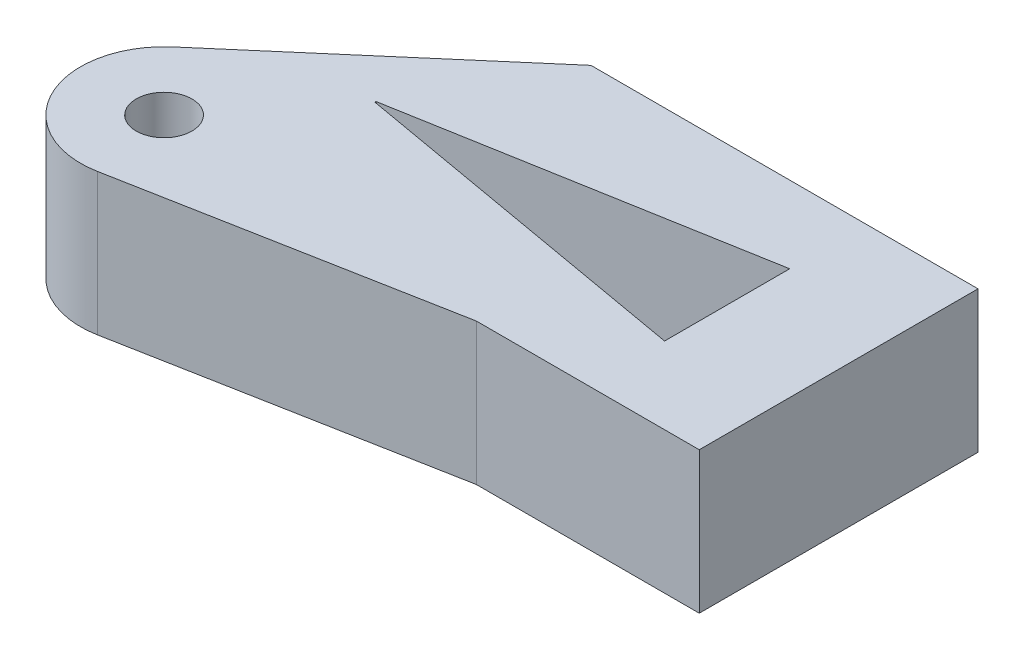
ISO-10303-21;
HEADER;
FILE_DESCRIPTION(('STEP AP214'),'2;1');
FILE_NAME('part.step','',(''),(''),'','','');
FILE_SCHEMA(('AUTOMOTIVE_DESIGN { 1 0 10303 214 1 1 1 1 }'));
ENDSEC;
DATA;
#1=APPLICATION_CONTEXT('core data for automotive mechanical design processes');
#2=APPLICATION_PROTOCOL_DEFINITION('international standard','automotive_design',2000,#1);
#3=PRODUCT_CONTEXT('',#1,'mechanical');
#4=PRODUCT('Part','Part','',(#3));
#5=PRODUCT_RELATED_PRODUCT_CATEGORY('part','',(#4));
#6=PRODUCT_DEFINITION_FORMATION('','',#4);
#7=PRODUCT_DEFINITION_CONTEXT('part definition',#1,'design');
#8=PRODUCT_DEFINITION('design','',#6,#7);
#9=PRODUCT_DEFINITION_SHAPE('','',#8);
#10=(LENGTH_UNIT() NAMED_UNIT(*) SI_UNIT(.MILLI.,.METRE.));
#11=(NAMED_UNIT(*) PLANE_ANGLE_UNIT() SI_UNIT($,.RADIAN.));
#12=(NAMED_UNIT(*) SI_UNIT($,.STERADIAN.) SOLID_ANGLE_UNIT());
#13=UNCERTAINTY_MEASURE_WITH_UNIT(LENGTH_MEASURE(1.E-05),#10,'distance_accuracy_value','');
#14=(GEOMETRIC_REPRESENTATION_CONTEXT(3) GLOBAL_UNCERTAINTY_ASSIGNED_CONTEXT((#13)) GLOBAL_UNIT_ASSIGNED_CONTEXT((#10,
#11,#12)) REPRESENTATION_CONTEXT('',''));
#15=CARTESIAN_POINT('',(0.,0.,0.));
#16=DIRECTION('',(0.,0.,1.));
#17=DIRECTION('',(1.,0.,0.));
#18=AXIS2_PLACEMENT_3D('',#15,#16,#17);
#19=CARTESIAN_POINT('',(-30.,6.35,10.5));
#20=DIRECTION('',(0.,-1.,0.));
#21=DIRECTION('',(0.,0.,-1.));
#22=AXIS2_PLACEMENT_3D('',#19,#20,#21);
#23=PLANE('',#22);
#24=CARTESIAN_POINT('',(-30.,6.35,10.5));
#25=DIRECTION('',(0.,1.,0.));
#26=DIRECTION('',(0.,0.,1.));
#27=AXIS2_PLACEMENT_3D('',#24,#25,#26);
#28=CIRCLE('',#27,2.5);
#29=CARTESIAN_POINT('',(-30.,6.35,13.));
#30=VERTEX_POINT('',#29);
#31=EDGE_CURVE('E146',#30,#30,#28,.T.);
#32=ORIENTED_EDGE('',*,*,#31,.F.);
#33=EDGE_LOOP('',(#32));
#34=FACE_BOUND('',#33,.T.);
#35=DIRECTION('',(-1.,0.,0.));
#36=VECTOR('',#35,1.);
#37=CARTESIAN_POINT('',(-14.7120380952852,6.35,-12.5));
#38=LINE('',#37,#36);
#39=CARTESIAN_POINT('',(20.,6.35,-12.5));
#40=VERTEX_POINT('',#39);
#41=CARTESIAN_POINT('',(-14.7120380952852,6.35,-12.5));
#42=VERTEX_POINT('',#41);
#43=EDGE_CURVE('E152',#40,#42,#38,.T.);
#44=ORIENTED_EDGE('',*,*,#43,.T.);
#45=DIRECTION('',(-0.758922798069636,0.,0.651180609792824));
#46=VECTOR('',#45,1.);
#47=CARTESIAN_POINT('',(-34.8838545734462,6.35,4.80807901447773));
#48=LINE('',#47,#46);
#49=CARTESIAN_POINT('',(-34.8838545734462,6.35,4.80807901447773));
#50=VERTEX_POINT('',#49);
#51=EDGE_CURVE('E155',#42,#50,#48,.T.);
#52=ORIENTED_EDGE('',*,*,#51,.T.);
#53=CARTESIAN_POINT('',(-30.,6.35,10.5));
#54=DIRECTION('',(0.,1.,0.));
#55=DIRECTION('',(0.,0.,-1.));
#56=AXIS2_PLACEMENT_3D('',#53,#54,#55);
#57=CIRCLE('',#56,7.5);
#58=CARTESIAN_POINT('',(-28.6164183637679,6.35,17.8712754565191));
#59=VERTEX_POINT('',#58);
#60=EDGE_CURVE('E158',#50,#59,#57,.T.);
#61=ORIENTED_EDGE('',*,*,#60,.T.);
#62=DIRECTION('',(0.982836727535885,0.,-0.184477551497608));
#63=VECTOR('',#62,1.);
#64=CARTESIAN_POINT('',(-28.6164183637679,6.35,17.8712754565191));
#65=LINE('',#64,#63);
#66=CARTESIAN_POINT('',(0.,6.35,12.5));
#67=VERTEX_POINT('',#66);
#68=EDGE_CURVE('E160',#59,#67,#65,.T.);
#69=ORIENTED_EDGE('',*,*,#68,.T.);
#70=DIRECTION('',(1.,0.,0.));
#71=VECTOR('',#70,1.);
#72=CARTESIAN_POINT('',(0.,6.35,12.5));
#73=LINE('',#72,#71);
#74=CARTESIAN_POINT('',(20.,6.35,12.5));
#75=VERTEX_POINT('',#74);
#76=EDGE_CURVE('E162',#67,#75,#73,.T.);
#77=ORIENTED_EDGE('',*,*,#76,.T.);
#78=DIRECTION('',(0.,0.,-1.));
#79=VECTOR('',#78,1.);
#80=CARTESIAN_POINT('',(20.,6.35,-12.5));
#81=LINE('',#80,#79);
#82=EDGE_CURVE('E164',#75,#40,#81,.T.);
#83=ORIENTED_EDGE('',*,*,#82,.T.);
#84=EDGE_LOOP('',(#44,#52,#61,#69,#77,#83));
#85=FACE_BOUND('',#84,.T.);
#86=DIRECTION('',(-0.984807753012208,0.,0.173648177666931));
#87=VECTOR('',#86,1.);
#88=CARTESIAN_POINT('',(-21.5420432854016,6.35,-0.051346502412947));
#89=LINE('',#88,#87);
#90=CARTESIAN_POINT('',(10.,6.35,-5.61305976030355));
#91=VERTEX_POINT('',#90);
#92=CARTESIAN_POINT('',(-21.5420432854016,6.35,-0.051346502412947));
#93=VERTEX_POINT('',#92);
#94=EDGE_CURVE('E110',#91,#93,#89,.T.);
#95=ORIENTED_EDGE('',*,*,#94,.F.);
#96=DIRECTION('',(0.,0.,-1.));
#97=VECTOR('',#96,1.);
#98=CARTESIAN_POINT('',(10.,6.35,-5.61305976030355));
#99=LINE('',#98,#97);
#100=CARTESIAN_POINT('',(9.99999999999999,6.35,5.61305976030355));
#101=VERTEX_POINT('',#100);
#102=EDGE_CURVE('E132',#101,#91,#99,.T.);
#103=ORIENTED_EDGE('',*,*,#102,.F.);
#104=DIRECTION('',(0.984807753012208,0.,0.173648177666931));
#105=VECTOR('',#104,1.);
#106=CARTESIAN_POINT('',(10.,6.35,5.61305976030355));
#107=LINE('',#106,#105);
#108=CARTESIAN_POINT('',(-21.5420432854016,6.35,0.051346502412947));
#109=VERTEX_POINT('',#108);
#110=EDGE_CURVE('E130',#109,#101,#107,.T.);
#111=ORIENTED_EDGE('',*,*,#110,.F.);
#112=DIRECTION('',(0.,0.,1.));
#113=VECTOR('',#112,1.);
#114=CARTESIAN_POINT('',(-21.5420432854016,6.35,-0.051346502412947));
#115=LINE('',#114,#113);
#116=EDGE_CURVE('E118',#93,#109,#115,.T.);
#117=ORIENTED_EDGE('',*,*,#116,.F.);
#118=EDGE_LOOP('',(#95,#103,#111,#117));
#119=FACE_BOUND('',#118,.T.);
#120=ADVANCED_FACE('F33',(#34,#85,#119),#23,.F.);
#121=CARTESIAN_POINT('',(-30.,-6.35,10.5));
#122=DIRECTION('',(0.,-1.,0.));
#123=DIRECTION('',(0.,0.,-1.));
#124=AXIS2_PLACEMENT_3D('',#121,#122,#123);
#125=PLANE('',#124);
#126=DIRECTION('',(-1.,0.,0.));
#127=VECTOR('',#126,1.);
#128=CARTESIAN_POINT('',(-14.7120380952852,-6.35,-12.5));
#129=LINE('',#128,#127);
#130=CARTESIAN_POINT('',(20.,-6.35,-12.5));
#131=VERTEX_POINT('',#130);
#132=CARTESIAN_POINT('',(-14.7120380952852,-6.35,-12.5));
#133=VERTEX_POINT('',#132);
#134=EDGE_CURVE('E149',#131,#133,#129,.T.);
#135=ORIENTED_EDGE('',*,*,#134,.F.);
#136=DIRECTION('',(0.,0.,-1.));
#137=VECTOR('',#136,1.);
#138=CARTESIAN_POINT('',(20.,-6.35,-12.5));
#139=LINE('',#138,#137);
#140=CARTESIAN_POINT('',(20.,-6.35,12.5));
#141=VERTEX_POINT('',#140);
#142=EDGE_CURVE('E156',#141,#131,#139,.T.);
#143=ORIENTED_EDGE('',*,*,#142,.F.);
#144=DIRECTION('',(1.,0.,0.));
#145=VECTOR('',#144,1.);
#146=CARTESIAN_POINT('',(0.,-6.35,12.5));
#147=LINE('',#146,#145);
#148=CARTESIAN_POINT('',(0.,-6.35,12.5));
#149=VERTEX_POINT('',#148);
#150=EDGE_CURVE('E175',#149,#141,#147,.T.);
#151=ORIENTED_EDGE('',*,*,#150,.F.);
#152=DIRECTION('',(0.982836727535885,0.,-0.184477551497608));
#153=VECTOR('',#152,1.);
#154=CARTESIAN_POINT('',(-28.6164183637679,-6.35,17.8712754565191));
#155=LINE('',#154,#153);
#156=CARTESIAN_POINT('',(-28.6164183637679,-6.35,17.8712754565191));
#157=VERTEX_POINT('',#156);
#158=EDGE_CURVE('E173',#157,#149,#155,.T.);
#159=ORIENTED_EDGE('',*,*,#158,.F.);
#160=CARTESIAN_POINT('',(-30.,-6.35,10.5));
#161=DIRECTION('',(0.,1.,0.));
#162=DIRECTION('',(0.,0.,-1.));
#163=AXIS2_PLACEMENT_3D('',#160,#161,#162);
#164=CIRCLE('',#163,7.5);
#165=CARTESIAN_POINT('',(-34.8838545734462,-6.35,4.80807901447773));
#166=VERTEX_POINT('',#165);
#167=EDGE_CURVE('E171',#166,#157,#164,.T.);
#168=ORIENTED_EDGE('',*,*,#167,.F.);
#169=DIRECTION('',(-0.758922798069636,0.,0.651180609792824));
#170=VECTOR('',#169,1.);
#171=CARTESIAN_POINT('',(-34.8838545734462,-6.35,4.80807901447773));
#172=LINE('',#171,#170);
#173=EDGE_CURVE('E169',#133,#166,#172,.T.);
#174=ORIENTED_EDGE('',*,*,#173,.F.);
#175=EDGE_LOOP('',(#135,#143,#151,#159,#168,#174));
#176=FACE_BOUND('',#175,.T.);
#177=CARTESIAN_POINT('',(-30.,-6.35,10.5));
#178=DIRECTION('',(0.,1.,0.));
#179=DIRECTION('',(0.,0.,1.));
#180=AXIS2_PLACEMENT_3D('',#177,#178,#179);
#181=CIRCLE('',#180,2.5);
#182=CARTESIAN_POINT('',(-30.,-6.35,13.));
#183=VERTEX_POINT('',#182);
#184=EDGE_CURVE('E126',#183,#183,#181,.T.);
#185=ORIENTED_EDGE('',*,*,#184,.T.);
#186=EDGE_LOOP('',(#185));
#187=FACE_BOUND('',#186,.T.);
#188=DIRECTION('',(0.,0.,-1.));
#189=VECTOR('',#188,1.);
#190=CARTESIAN_POINT('',(10.,-6.35,-5.61305976030355));
#191=LINE('',#190,#189);
#192=CARTESIAN_POINT('',(10.,-6.35,5.61305976030355));
#193=VERTEX_POINT('',#192);
#194=CARTESIAN_POINT('',(9.99999999999999,-6.35,-5.61305976030355));
#195=VERTEX_POINT('',#194);
#196=EDGE_CURVE('E119',#193,#195,#191,.T.);
#197=ORIENTED_EDGE('',*,*,#196,.T.);
#198=DIRECTION('',(-0.984807753012208,0.,0.173648177666931));
#199=VECTOR('',#198,1.);
#200=CARTESIAN_POINT('',(-21.5420432854016,-6.35,-0.051346502412947));
#201=LINE('',#200,#199);
#202=CARTESIAN_POINT('',(-21.5420432854016,-6.35,-0.051346502412947));
#203=VERTEX_POINT('',#202);
#204=EDGE_CURVE('E56',#195,#203,#201,.T.);
#205=ORIENTED_EDGE('',*,*,#204,.T.);
#206=DIRECTION('',(0.,0.,1.));
#207=VECTOR('',#206,1.);
#208=CARTESIAN_POINT('',(-21.5420432854016,-6.35,-0.051346502412947));
#209=LINE('',#208,#207);
#210=CARTESIAN_POINT('',(-21.5420432854016,-6.35,0.051346502412947));
#211=VERTEX_POINT('',#210);
#212=EDGE_CURVE('E125',#203,#211,#209,.T.);
#213=ORIENTED_EDGE('',*,*,#212,.T.);
#214=DIRECTION('',(0.984807753012208,0.,0.173648177666931));
#215=VECTOR('',#214,1.);
#216=CARTESIAN_POINT('',(10.,-6.35,5.61305976030355));
#217=LINE('',#216,#215);
#218=EDGE_CURVE('E138',#211,#193,#217,.T.);
#219=ORIENTED_EDGE('',*,*,#218,.T.);
#220=EDGE_LOOP('',(#197,#205,#213,#219));
#221=FACE_BOUND('',#220,.T.);
#222=ADVANCED_FACE('F199',(#176,#187,#221),#125,.T.);
#223=CARTESIAN_POINT('',(-14.7120380952852,6.35,-12.5));
#224=DIRECTION('',(0.,0.,1.));
#225=DIRECTION('',(1.,0.,0.));
#226=AXIS2_PLACEMENT_3D('',#223,#224,#225);
#227=PLANE('',#226);
#228=ORIENTED_EDGE('',*,*,#134,.T.);
#229=DIRECTION('',(0.,-1.,0.));
#230=VECTOR('',#229,1.);
#231=CARTESIAN_POINT('',(-14.7120380952852,6.35,-12.5));
#232=LINE('',#231,#230);
#233=EDGE_CURVE('E11',#42,#133,#232,.T.);
#234=ORIENTED_EDGE('',*,*,#233,.F.);
#235=ORIENTED_EDGE('',*,*,#43,.F.);
#236=DIRECTION('',(0.,-1.,0.));
#237=VECTOR('',#236,1.);
#238=CARTESIAN_POINT('',(20.,6.35,-12.5));
#239=LINE('',#238,#237);
#240=EDGE_CURVE('E166',#40,#131,#239,.T.);
#241=ORIENTED_EDGE('',*,*,#240,.T.);
#242=EDGE_LOOP('',(#228,#234,#235,#241));
#243=FACE_BOUND('',#242,.T.);
#244=ADVANCED_FACE('F35',(#243),#227,.F.);
#245=CARTESIAN_POINT('',(-34.8838545734462,6.35,4.80807901447773));
#246=DIRECTION('',(0.651180609792824,0.,0.758922798069636));
#247=DIRECTION('',(0.758922798069636,0.,-0.651180609792824));
#248=AXIS2_PLACEMENT_3D('',#245,#246,#247);
#249=PLANE('',#248);
#250=ORIENTED_EDGE('',*,*,#173,.T.);
#251=DIRECTION('',(0.,-1.,0.));
#252=VECTOR('',#251,1.);
#253=CARTESIAN_POINT('',(-34.8838545734462,6.35,4.80807901447773));
#254=LINE('',#253,#252);
#255=EDGE_CURVE('E41',#50,#166,#254,.T.);
#256=ORIENTED_EDGE('',*,*,#255,.F.);
#257=ORIENTED_EDGE('',*,*,#51,.F.);
#258=ORIENTED_EDGE('',*,*,#233,.T.);
#259=EDGE_LOOP('',(#250,#256,#257,#258));
#260=FACE_BOUND('',#259,.T.);
#261=ADVANCED_FACE('F216',(#260),#249,.F.);
#262=CARTESIAN_POINT('',(-30.,6.35,10.5));
#263=DIRECTION('',(0.,-1.,0.));
#264=DIRECTION('',(0.,0.,-1.));
#265=AXIS2_PLACEMENT_3D('',#262,#263,#264);
#266=CYLINDRICAL_SURFACE('',#265,7.5);
#267=ORIENTED_EDGE('',*,*,#167,.T.);
#268=DIRECTION('',(0.,-1.,0.));
#269=VECTOR('',#268,1.);
#270=CARTESIAN_POINT('',(-28.6164183637679,6.35,17.8712754565191));
#271=LINE('',#270,#269);
#272=EDGE_CURVE('E186',#59,#157,#271,.T.);
#273=ORIENTED_EDGE('',*,*,#272,.F.);
#274=ORIENTED_EDGE('',*,*,#60,.F.);
#275=ORIENTED_EDGE('',*,*,#255,.T.);
#276=EDGE_LOOP('',(#267,#273,#274,#275));
#277=FACE_BOUND('',#276,.T.);
#278=ADVANCED_FACE('F193',(#277),#266,.T.);
#279=CARTESIAN_POINT('',(-28.6164183637679,6.35,17.8712754565191));
#280=DIRECTION('',(-0.184477551497608,0.,-0.982836727535885));
#281=DIRECTION('',(-0.982836727535885,0.,0.184477551497608));
#282=AXIS2_PLACEMENT_3D('',#279,#280,#281);
#283=PLANE('',#282);
#284=ORIENTED_EDGE('',*,*,#158,.T.);
#285=DIRECTION('',(0.,-1.,0.));
#286=VECTOR('',#285,1.);
#287=CARTESIAN_POINT('',(0.,6.35,12.5));
#288=LINE('',#287,#286);
#289=EDGE_CURVE('E183',#67,#149,#288,.T.);
#290=ORIENTED_EDGE('',*,*,#289,.F.);
#291=ORIENTED_EDGE('',*,*,#68,.F.);
#292=ORIENTED_EDGE('',*,*,#272,.T.);
#293=EDGE_LOOP('',(#284,#290,#291,#292));
#294=FACE_BOUND('',#293,.T.);
#295=ADVANCED_FACE('F205',(#294),#283,.F.);
#296=CARTESIAN_POINT('',(0.,6.35,12.5));
#297=DIRECTION('',(0.,0.,-1.));
#298=DIRECTION('',(-1.,0.,0.));
#299=AXIS2_PLACEMENT_3D('',#296,#297,#298);
#300=PLANE('',#299);
#301=ORIENTED_EDGE('',*,*,#150,.T.);
#302=DIRECTION('',(0.,-1.,0.));
#303=VECTOR('',#302,1.);
#304=CARTESIAN_POINT('',(20.,6.35,12.5));
#305=LINE('',#304,#303);
#306=EDGE_CURVE('E180',#75,#141,#305,.T.);
#307=ORIENTED_EDGE('',*,*,#306,.F.);
#308=ORIENTED_EDGE('',*,*,#76,.F.);
#309=ORIENTED_EDGE('',*,*,#289,.T.);
#310=EDGE_LOOP('',(#301,#307,#308,#309));
#311=FACE_BOUND('',#310,.T.);
#312=ADVANCED_FACE('F209',(#311),#300,.F.);
#313=CARTESIAN_POINT('',(20.,6.35,-12.5));
#314=DIRECTION('',(-1.,0.,0.));
#315=DIRECTION('',(0.,0.,1.));
#316=AXIS2_PLACEMENT_3D('',#313,#314,#315);
#317=PLANE('',#316);
#318=ORIENTED_EDGE('',*,*,#142,.T.);
#319=ORIENTED_EDGE('',*,*,#240,.F.);
#320=ORIENTED_EDGE('',*,*,#82,.F.);
#321=ORIENTED_EDGE('',*,*,#306,.T.);
#322=EDGE_LOOP('',(#318,#319,#320,#321));
#323=FACE_BOUND('',#322,.T.);
#324=ADVANCED_FACE('F219',(#323),#317,.F.);
#325=CARTESIAN_POINT('',(-30.,6.35,10.5));
#326=DIRECTION('',(0.,-1.,0.));
#327=DIRECTION('',(0.,0.,-1.));
#328=AXIS2_PLACEMENT_3D('',#325,#326,#327);
#329=CYLINDRICAL_SURFACE('',#328,2.5);
#330=ORIENTED_EDGE('',*,*,#31,.T.);
#331=EDGE_LOOP('',(#330));
#332=FACE_BOUND('',#331,.T.);
#333=ORIENTED_EDGE('',*,*,#184,.F.);
#334=EDGE_LOOP('',(#333));
#335=FACE_BOUND('',#334,.T.);
#336=ADVANCED_FACE('F221',(#332,#335),#329,.F.);
#337=CARTESIAN_POINT('',(-21.5420432854016,6.35,-0.051346502412947));
#338=DIRECTION('',(0.173648177666931,0.,0.984807753012208));
#339=DIRECTION('',(0.984807753012208,0.,-0.173648177666931));
#340=AXIS2_PLACEMENT_3D('',#337,#338,#339);
#341=PLANE('',#340);
#342=ORIENTED_EDGE('',*,*,#204,.F.);
#343=DIRECTION('',(0.,-1.,0.));
#344=VECTOR('',#343,1.);
#345=CARTESIAN_POINT('',(10.,6.35,-5.61305976030355));
#346=LINE('',#345,#344);
#347=EDGE_CURVE('E114',#91,#195,#346,.T.);
#348=ORIENTED_EDGE('',*,*,#347,.F.);
#349=ORIENTED_EDGE('',*,*,#94,.T.);
#350=DIRECTION('',(0.,-1.,0.));
#351=VECTOR('',#350,1.);
#352=CARTESIAN_POINT('',(-21.5420432854016,6.35,-0.051346502412947));
#353=LINE('',#352,#351);
#354=EDGE_CURVE('E113',#93,#203,#353,.T.);
#355=ORIENTED_EDGE('',*,*,#354,.T.);
#356=EDGE_LOOP('',(#342,#348,#349,#355));
#357=FACE_BOUND('',#356,.T.);
#358=ADVANCED_FACE('F112',(#357),#341,.T.);
#359=CARTESIAN_POINT('',(-21.5420432854016,6.35,-0.051346502412947));
#360=DIRECTION('',(1.,0.,0.));
#361=DIRECTION('',(0.,0.,-1.));
#362=AXIS2_PLACEMENT_3D('',#359,#360,#361);
#363=PLANE('',#362);
#364=ORIENTED_EDGE('',*,*,#212,.F.);
#365=ORIENTED_EDGE('',*,*,#354,.F.);
#366=ORIENTED_EDGE('',*,*,#116,.T.);
#367=DIRECTION('',(0.,-1.,0.));
#368=VECTOR('',#367,1.);
#369=CARTESIAN_POINT('',(-21.5420432854016,6.35,0.051346502412947));
#370=LINE('',#369,#368);
#371=EDGE_CURVE('E127',#109,#211,#370,.T.);
#372=ORIENTED_EDGE('',*,*,#371,.T.);
#373=EDGE_LOOP('',(#364,#365,#366,#372));
#374=FACE_BOUND('',#373,.T.);
#375=ADVANCED_FACE('F122',(#374),#363,.T.);
#376=CARTESIAN_POINT('',(10.,6.35,5.61305976030355));
#377=DIRECTION('',(0.173648177666931,0.,-0.984807753012208));
#378=DIRECTION('',(-0.984807753012208,0.,-0.173648177666931));
#379=AXIS2_PLACEMENT_3D('',#376,#377,#378);
#380=PLANE('',#379);
#381=ORIENTED_EDGE('',*,*,#218,.F.);
#382=ORIENTED_EDGE('',*,*,#371,.F.);
#383=ORIENTED_EDGE('',*,*,#110,.T.);
#384=DIRECTION('',(0.,-1.,0.));
#385=VECTOR('',#384,1.);
#386=CARTESIAN_POINT('',(10.,6.35,5.61305976030355));
#387=LINE('',#386,#385);
#388=EDGE_CURVE('E48',#101,#193,#387,.T.);
#389=ORIENTED_EDGE('',*,*,#388,.T.);
#390=EDGE_LOOP('',(#381,#382,#383,#389));
#391=FACE_BOUND('',#390,.T.);
#392=ADVANCED_FACE('F243',(#391),#380,.T.);
#393=CARTESIAN_POINT('',(10.,6.35,-5.61305976030355));
#394=DIRECTION('',(-1.,0.,0.));
#395=DIRECTION('',(0.,0.,1.));
#396=AXIS2_PLACEMENT_3D('',#393,#394,#395);
#397=PLANE('',#396);
#398=ORIENTED_EDGE('',*,*,#196,.F.);
#399=ORIENTED_EDGE('',*,*,#388,.F.);
#400=ORIENTED_EDGE('',*,*,#102,.T.);
#401=ORIENTED_EDGE('',*,*,#347,.T.);
#402=EDGE_LOOP('',(#398,#399,#400,#401));
#403=FACE_BOUND('',#402,.T.);
#404=ADVANCED_FACE('F246',(#403),#397,.T.);
#405=CLOSED_SHELL('',(#120,#222,#244,#261,#278,#295,#312,#324,#336,#358,#375,#392,#404));
#406=MANIFOLD_SOLID_BREP('B2',#405);
#407=ADVANCED_BREP_SHAPE_REPRESENTATION('',(#18,#406),#14);
#408=SHAPE_DEFINITION_REPRESENTATION(#9,#407);
ENDSEC;
END-ISO-10303-21;
